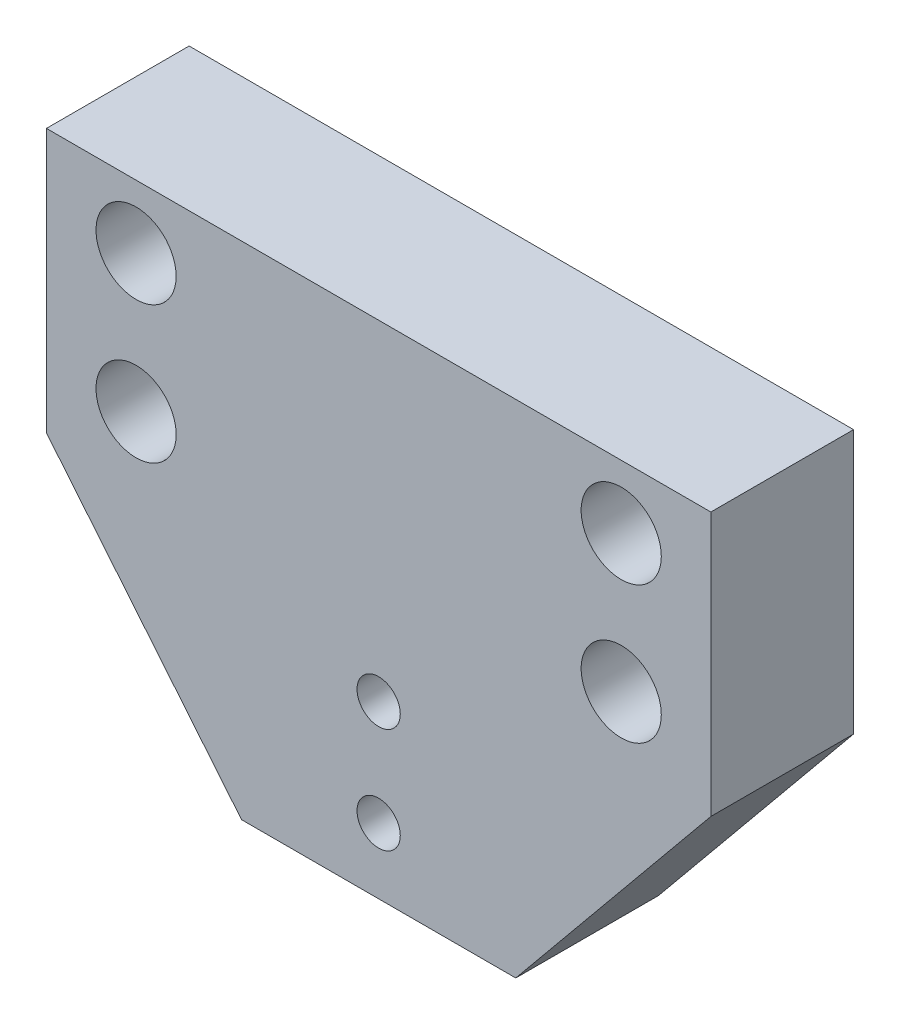
ISO-10303-21;
HEADER;
FILE_DESCRIPTION(('STEP AP214'),'2;1');
FILE_NAME('part.step','',(''),(''),'','','');
FILE_SCHEMA(('AUTOMOTIVE_DESIGN { 1 0 10303 214 1 1 1 1 }'));
ENDSEC;
DATA;
#1=APPLICATION_CONTEXT('core data for automotive mechanical design processes');
#2=APPLICATION_PROTOCOL_DEFINITION('international standard','automotive_design',2000,#1);
#3=PRODUCT_CONTEXT('',#1,'mechanical');
#4=PRODUCT('Part','Part','',(#3));
#5=PRODUCT_RELATED_PRODUCT_CATEGORY('part','',(#4));
#6=PRODUCT_DEFINITION_FORMATION('','',#4);
#7=PRODUCT_DEFINITION_CONTEXT('part definition',#1,'design');
#8=PRODUCT_DEFINITION('design','',#6,#7);
#9=PRODUCT_DEFINITION_SHAPE('','',#8);
#10=(LENGTH_UNIT() NAMED_UNIT(*) SI_UNIT(.MILLI.,.METRE.));
#11=(NAMED_UNIT(*) PLANE_ANGLE_UNIT() SI_UNIT($,.RADIAN.));
#12=(NAMED_UNIT(*) SI_UNIT($,.STERADIAN.) SOLID_ANGLE_UNIT());
#13=UNCERTAINTY_MEASURE_WITH_UNIT(LENGTH_MEASURE(1.E-05),#10,'distance_accuracy_value','');
#14=(GEOMETRIC_REPRESENTATION_CONTEXT(3) GLOBAL_UNCERTAINTY_ASSIGNED_CONTEXT((#13)) GLOBAL_UNIT_ASSIGNED_CONTEXT((#10,
#11,#12)) REPRESENTATION_CONTEXT('',''));
#15=CARTESIAN_POINT('',(0.,0.,0.));
#16=DIRECTION('',(0.,0.,1.));
#17=DIRECTION('',(1.,0.,0.));
#18=AXIS2_PLACEMENT_3D('',#15,#16,#17);
#19=CARTESIAN_POINT('',(31.5,0.,13.53));
#20=DIRECTION('',(1.,0.,0.));
#21=DIRECTION('',(0.,0.,-1.));
#22=AXIS2_PLACEMENT_3D('',#19,#20,#21);
#23=PLANE('',#22);
#24=DIRECTION('',(0.,-1.,0.));
#25=VECTOR('',#24,1.);
#26=CARTESIAN_POINT('',(31.5,0.,0.));
#27=LINE('',#26,#25);
#28=CARTESIAN_POINT('',(31.5,9.99999999999999,0.));
#29=VERTEX_POINT('',#28);
#30=CARTESIAN_POINT('',(31.5,-15.,0.));
#31=VERTEX_POINT('',#30);
#32=EDGE_CURVE('E127',#29,#31,#27,.T.);
#33=ORIENTED_EDGE('',*,*,#32,.F.);
#34=DIRECTION('',(0.,0.,-1.));
#35=VECTOR('',#34,1.);
#36=CARTESIAN_POINT('',(31.5,9.99999999999999,13.53));
#37=LINE('',#36,#35);
#38=CARTESIAN_POINT('',(31.5,9.99999999999999,13.53));
#39=VERTEX_POINT('',#38);
#40=EDGE_CURVE('E11',#39,#29,#37,.T.);
#41=ORIENTED_EDGE('',*,*,#40,.F.);
#42=DIRECTION('',(0.,-1.,0.));
#43=VECTOR('',#42,1.);
#44=CARTESIAN_POINT('',(31.5,0.,13.53));
#45=LINE('',#44,#43);
#46=CARTESIAN_POINT('',(31.5,-15.,13.53));
#47=VERTEX_POINT('',#46);
#48=EDGE_CURVE('E62',#39,#47,#45,.T.);
#49=ORIENTED_EDGE('',*,*,#48,.T.);
#50=DIRECTION('',(0.,0.,-1.));
#51=VECTOR('',#50,1.);
#52=CARTESIAN_POINT('',(31.5,-15.,13.53));
#53=LINE('',#52,#51);
#54=EDGE_CURVE('E81',#47,#31,#53,.T.);
#55=ORIENTED_EDGE('',*,*,#54,.T.);
#56=EDGE_LOOP('',(#33,#41,#49,#55));
#57=FACE_BOUND('',#56,.T.);
#58=ADVANCED_FACE('F45',(#57),#23,.T.);
#59=CARTESIAN_POINT('',(0.,9.99999999999999,13.53));
#60=DIRECTION('',(0.,-1.,0.));
#61=DIRECTION('',(1.,0.,0.));
#62=AXIS2_PLACEMENT_3D('',#59,#60,#61);
#63=PLANE('',#62);
#64=DIRECTION('',(-1.,0.,0.));
#65=VECTOR('',#64,1.);
#66=CARTESIAN_POINT('',(0.,9.99999999999999,0.));
#67=LINE('',#66,#65);
#68=CARTESIAN_POINT('',(-31.5,10.,0.));
#69=VERTEX_POINT('',#68);
#70=EDGE_CURVE('E76',#29,#69,#67,.T.);
#71=ORIENTED_EDGE('',*,*,#70,.T.);
#72=DIRECTION('',(0.,0.,-1.));
#73=VECTOR('',#72,1.);
#74=CARTESIAN_POINT('',(-31.5,10.,13.53));
#75=LINE('',#74,#73);
#76=CARTESIAN_POINT('',(-31.5,10.,13.53));
#77=VERTEX_POINT('',#76);
#78=EDGE_CURVE('E54',#77,#69,#75,.T.);
#79=ORIENTED_EDGE('',*,*,#78,.F.);
#80=DIRECTION('',(-1.,0.,0.));
#81=VECTOR('',#80,1.);
#82=CARTESIAN_POINT('',(0.,9.99999999999999,13.53));
#83=LINE('',#82,#81);
#84=EDGE_CURVE('E138',#39,#77,#83,.T.);
#85=ORIENTED_EDGE('',*,*,#84,.F.);
#86=ORIENTED_EDGE('',*,*,#40,.T.);
#87=EDGE_LOOP('',(#71,#79,#85,#86));
#88=FACE_BOUND('',#87,.T.);
#89=ADVANCED_FACE('F240',(#88),#63,.F.);
#90=CARTESIAN_POINT('',(-31.5,0.,13.53));
#91=DIRECTION('',(1.,0.,0.));
#92=DIRECTION('',(0.,0.,-1.));
#93=AXIS2_PLACEMENT_3D('',#90,#91,#92);
#94=PLANE('',#93);
#95=DIRECTION('',(0.,-1.,0.));
#96=VECTOR('',#95,1.);
#97=CARTESIAN_POINT('',(-31.5,0.,0.));
#98=LINE('',#97,#96);
#99=CARTESIAN_POINT('',(-31.5,-15.,0.));
#100=VERTEX_POINT('',#99);
#101=EDGE_CURVE('E163',#69,#100,#98,.T.);
#102=ORIENTED_EDGE('',*,*,#101,.T.);
#103=DIRECTION('',(0.,0.,-1.));
#104=VECTOR('',#103,1.);
#105=CARTESIAN_POINT('',(-31.5,-15.,13.53));
#106=LINE('',#105,#104);
#107=CARTESIAN_POINT('',(-31.5,-15.,13.53));
#108=VERTEX_POINT('',#107);
#109=EDGE_CURVE('E183',#108,#100,#106,.T.);
#110=ORIENTED_EDGE('',*,*,#109,.F.);
#111=DIRECTION('',(0.,-1.,0.));
#112=VECTOR('',#111,1.);
#113=CARTESIAN_POINT('',(-31.5,0.,13.53));
#114=LINE('',#113,#112);
#115=EDGE_CURVE('E142',#77,#108,#114,.T.);
#116=ORIENTED_EDGE('',*,*,#115,.F.);
#117=ORIENTED_EDGE('',*,*,#78,.T.);
#118=EDGE_LOOP('',(#102,#110,#116,#117));
#119=FACE_BOUND('',#118,.T.);
#120=ADVANCED_FACE('F190',(#119),#94,.F.);
#121=CARTESIAN_POINT('',(23.,-9.00000000000001,13.53));
#122=DIRECTION('',(0.,0.,-1.));
#123=DIRECTION('',(-1.,0.,0.));
#124=AXIS2_PLACEMENT_3D('',#121,#122,#123);
#125=CYLINDRICAL_SURFACE('',#124,3.8);
#126=CARTESIAN_POINT('',(23.,-9.00000000000001,13.53));
#127=DIRECTION('',(0.,0.,1.));
#128=DIRECTION('',(1.,0.,0.));
#129=AXIS2_PLACEMENT_3D('',#126,#127,#128);
#130=CIRCLE('',#129,3.8);
#131=CARTESIAN_POINT('',(26.8,-9.00000000000001,13.53));
#132=VERTEX_POINT('',#131);
#133=EDGE_CURVE('E153',#132,#132,#130,.F.);
#134=ORIENTED_EDGE('',*,*,#133,.F.);
#135=EDGE_LOOP('',(#134));
#136=FACE_BOUND('',#135,.T.);
#137=CARTESIAN_POINT('',(23.,-9.00000000000001,0.));
#138=DIRECTION('',(0.,0.,1.));
#139=DIRECTION('',(1.,0.,0.));
#140=AXIS2_PLACEMENT_3D('',#137,#138,#139);
#141=CIRCLE('',#140,3.8);
#142=CARTESIAN_POINT('',(26.8,-9.00000000000001,0.));
#143=VERTEX_POINT('',#142);
#144=EDGE_CURVE('E174',#143,#143,#141,.F.);
#145=ORIENTED_EDGE('',*,*,#144,.T.);
#146=EDGE_LOOP('',(#145));
#147=FACE_BOUND('',#146,.T.);
#148=ADVANCED_FACE('F247',(#136,#147),#125,.F.);
#149=CARTESIAN_POINT('',(-23.,-9.00000000000001,13.53));
#150=DIRECTION('',(0.,0.,-1.));
#151=DIRECTION('',(-1.,0.,0.));
#152=AXIS2_PLACEMENT_3D('',#149,#150,#151);
#153=CYLINDRICAL_SURFACE('',#152,3.8);
#154=CARTESIAN_POINT('',(-23.,-9.00000000000001,13.53));
#155=DIRECTION('',(0.,0.,1.));
#156=DIRECTION('',(1.,0.,0.));
#157=AXIS2_PLACEMENT_3D('',#154,#155,#156);
#158=CIRCLE('',#157,3.8);
#159=CARTESIAN_POINT('',(-19.2,-9.00000000000001,13.53));
#160=VERTEX_POINT('',#159);
#161=EDGE_CURVE('E149',#160,#160,#158,.T.);
#162=ORIENTED_EDGE('',*,*,#161,.T.);
#163=EDGE_LOOP('',(#162));
#164=FACE_BOUND('',#163,.T.);
#165=CARTESIAN_POINT('',(-23.,-9.00000000000001,0.));
#166=DIRECTION('',(0.,0.,1.));
#167=DIRECTION('',(1.,0.,0.));
#168=AXIS2_PLACEMENT_3D('',#165,#166,#167);
#169=CIRCLE('',#168,3.8);
#170=CARTESIAN_POINT('',(-19.2,-9.00000000000001,0.));
#171=VERTEX_POINT('',#170);
#172=EDGE_CURVE('E170',#171,#171,#169,.T.);
#173=ORIENTED_EDGE('',*,*,#172,.F.);
#174=EDGE_LOOP('',(#173));
#175=FACE_BOUND('',#174,.T.);
#176=ADVANCED_FACE('F252',(#164,#175),#153,.F.);
#177=CARTESIAN_POINT('',(-23.,4.,13.53));
#178=DIRECTION('',(0.,0.,-1.));
#179=DIRECTION('',(-1.,0.,0.));
#180=AXIS2_PLACEMENT_3D('',#177,#178,#179);
#181=CYLINDRICAL_SURFACE('',#180,3.8);
#182=CARTESIAN_POINT('',(-23.,4.,13.53));
#183=DIRECTION('',(0.,0.,1.));
#184=DIRECTION('',(1.,0.,0.));
#185=AXIS2_PLACEMENT_3D('',#182,#183,#184);
#186=CIRCLE('',#185,3.8);
#187=CARTESIAN_POINT('',(-19.2,4.,13.53));
#188=VERTEX_POINT('',#187);
#189=EDGE_CURVE('E145',#188,#188,#186,.T.);
#190=ORIENTED_EDGE('',*,*,#189,.T.);
#191=EDGE_LOOP('',(#190));
#192=FACE_BOUND('',#191,.T.);
#193=CARTESIAN_POINT('',(-23.,4.,0.));
#194=DIRECTION('',(0.,0.,1.));
#195=DIRECTION('',(1.,0.,0.));
#196=AXIS2_PLACEMENT_3D('',#193,#194,#195);
#197=CIRCLE('',#196,3.8);
#198=CARTESIAN_POINT('',(-19.2,4.,0.));
#199=VERTEX_POINT('',#198);
#200=EDGE_CURVE('E166',#199,#199,#197,.T.);
#201=ORIENTED_EDGE('',*,*,#200,.F.);
#202=EDGE_LOOP('',(#201));
#203=FACE_BOUND('',#202,.T.);
#204=ADVANCED_FACE('F235',(#192,#203),#181,.F.);
#205=CARTESIAN_POINT('',(23.,4.,13.53));
#206=DIRECTION('',(0.,0.,-1.));
#207=DIRECTION('',(-1.,0.,0.));
#208=AXIS2_PLACEMENT_3D('',#205,#206,#207);
#209=CYLINDRICAL_SURFACE('',#208,3.8);
#210=CARTESIAN_POINT('',(23.,4.,13.53));
#211=DIRECTION('',(0.,0.,1.));
#212=DIRECTION('',(1.,0.,0.));
#213=AXIS2_PLACEMENT_3D('',#210,#211,#212);
#214=CIRCLE('',#213,3.8);
#215=CARTESIAN_POINT('',(26.8,4.,13.53));
#216=VERTEX_POINT('',#215);
#217=EDGE_CURVE('E157',#216,#216,#214,.F.);
#218=ORIENTED_EDGE('',*,*,#217,.F.);
#219=EDGE_LOOP('',(#218));
#220=FACE_BOUND('',#219,.T.);
#221=CARTESIAN_POINT('',(23.,4.,0.));
#222=DIRECTION('',(0.,0.,1.));
#223=DIRECTION('',(1.,0.,0.));
#224=AXIS2_PLACEMENT_3D('',#221,#222,#223);
#225=CIRCLE('',#224,3.8);
#226=CARTESIAN_POINT('',(26.8,4.,0.));
#227=VERTEX_POINT('',#226);
#228=EDGE_CURVE('E139',#227,#227,#225,.F.);
#229=ORIENTED_EDGE('',*,*,#228,.T.);
#230=EDGE_LOOP('',(#229));
#231=FACE_BOUND('',#230,.T.);
#232=ADVANCED_FACE('F228',(#220,#231),#209,.F.);
#233=CARTESIAN_POINT('',(0.,0.,13.53));
#234=DIRECTION('',(0.,0.,1.));
#235=DIRECTION('',(1.,0.,0.));
#236=AXIS2_PLACEMENT_3D('',#233,#234,#235);
#237=PLANE('',#236);
#238=ORIENTED_EDGE('',*,*,#48,.F.);
#239=ORIENTED_EDGE('',*,*,#84,.T.);
#240=ORIENTED_EDGE('',*,*,#115,.T.);
#241=DIRECTION('',(-0.63484159071382,0.772642320029098,0.));
#242=VECTOR('',#241,1.);
#243=CARTESIAN_POINT('',(-26.1623310655497,-21.4962802837536,13.53));
#244=LINE('',#243,#242);
#245=CARTESIAN_POINT('',(-13.,-37.5156686795933,13.53));
#246=VERTEX_POINT('',#245);
#247=EDGE_CURVE('E111',#246,#108,#244,.T.);
#248=ORIENTED_EDGE('',*,*,#247,.F.);
#249=DIRECTION('',(1.,0.,0.));
#250=VECTOR('',#249,1.);
#251=CARTESIAN_POINT('',(0.,-37.5156686795933,13.53));
#252=LINE('',#251,#250);
#253=CARTESIAN_POINT('',(13.,-37.5156686795933,13.53));
#254=VERTEX_POINT('',#253);
#255=EDGE_CURVE('E112',#246,#254,#252,.T.);
#256=ORIENTED_EDGE('',*,*,#255,.T.);
#257=DIRECTION('',(0.63484159071382,0.772642320029098,0.));
#258=VECTOR('',#257,1.);
#259=CARTESIAN_POINT('',(26.1623310655497,-21.4962802837536,13.53));
#260=LINE('',#259,#258);
#261=EDGE_CURVE('E102',#254,#47,#260,.T.);
#262=ORIENTED_EDGE('',*,*,#261,.T.);
#263=EDGE_LOOP('',(#238,#239,#240,#248,#256,#262));
#264=FACE_BOUND('',#263,.T.);
#265=ORIENTED_EDGE('',*,*,#189,.F.);
#266=EDGE_LOOP('',(#265));
#267=FACE_BOUND('',#266,.T.);
#268=ORIENTED_EDGE('',*,*,#161,.F.);
#269=EDGE_LOOP('',(#268));
#270=FACE_BOUND('',#269,.T.);
#271=ORIENTED_EDGE('',*,*,#133,.T.);
#272=EDGE_LOOP('',(#271));
#273=FACE_BOUND('',#272,.T.);
#274=ORIENTED_EDGE('',*,*,#217,.T.);
#275=EDGE_LOOP('',(#274));
#276=FACE_BOUND('',#275,.T.);
#277=CARTESIAN_POINT('',(0.,-31.2999555570793,13.53));
#278=DIRECTION('',(0.,0.,1.));
#279=DIRECTION('',(1.,0.,0.));
#280=AXIS2_PLACEMENT_3D('',#277,#278,#279);
#281=CIRCLE('',#280,2.05);
#282=CARTESIAN_POINT('',(2.05,-31.2999555570793,13.53));
#283=VERTEX_POINT('',#282);
#284=EDGE_CURVE('E200',#283,#283,#281,.T.);
#285=ORIENTED_EDGE('',*,*,#284,.F.);
#286=EDGE_LOOP('',(#285));
#287=FACE_BOUND('',#286,.T.);
#288=CARTESIAN_POINT('',(0.,-21.3220695835742,13.53));
#289=DIRECTION('',(0.,0.,1.));
#290=DIRECTION('',(1.,0.,0.));
#291=AXIS2_PLACEMENT_3D('',#288,#289,#290);
#292=CIRCLE('',#291,2.05);
#293=CARTESIAN_POINT('',(2.05,-21.3220695835742,13.53));
#294=VERTEX_POINT('',#293);
#295=EDGE_CURVE('E121',#294,#294,#292,.T.);
#296=ORIENTED_EDGE('',*,*,#295,.F.);
#297=EDGE_LOOP('',(#296));
#298=FACE_BOUND('',#297,.T.);
#299=ADVANCED_FACE('F116',(#264,#267,#270,#273,#276,#287,#298),#237,.T.);
#300=CARTESIAN_POINT('',(0.,0.,0.));
#301=DIRECTION('',(0.,0.,1.));
#302=DIRECTION('',(1.,0.,0.));
#303=AXIS2_PLACEMENT_3D('',#300,#301,#302);
#304=PLANE('',#303);
#305=ORIENTED_EDGE('',*,*,#32,.T.);
#306=DIRECTION('',(0.63484159071382,0.772642320029098,0.));
#307=VECTOR('',#306,1.);
#308=CARTESIAN_POINT('',(26.1623310655497,-21.4962802837536,0.));
#309=LINE('',#308,#307);
#310=CARTESIAN_POINT('',(13.,-37.5156686795933,0.));
#311=VERTEX_POINT('',#310);
#312=EDGE_CURVE('E201',#311,#31,#309,.T.);
#313=ORIENTED_EDGE('',*,*,#312,.F.);
#314=DIRECTION('',(1.,0.,0.));
#315=VECTOR('',#314,1.);
#316=CARTESIAN_POINT('',(0.,-37.5156686795933,0.));
#317=LINE('',#316,#315);
#318=CARTESIAN_POINT('',(-13.,-37.5156686795933,0.));
#319=VERTEX_POINT('',#318);
#320=EDGE_CURVE('E125',#319,#311,#317,.T.);
#321=ORIENTED_EDGE('',*,*,#320,.F.);
#322=DIRECTION('',(-0.63484159071382,0.772642320029098,0.));
#323=VECTOR('',#322,1.);
#324=CARTESIAN_POINT('',(-26.1623310655497,-21.4962802837536,0.));
#325=LINE('',#324,#323);
#326=EDGE_CURVE('E197',#319,#100,#325,.T.);
#327=ORIENTED_EDGE('',*,*,#326,.T.);
#328=ORIENTED_EDGE('',*,*,#101,.F.);
#329=ORIENTED_EDGE('',*,*,#70,.F.);
#330=EDGE_LOOP('',(#305,#313,#321,#327,#328,#329));
#331=FACE_BOUND('',#330,.T.);
#332=ORIENTED_EDGE('',*,*,#200,.T.);
#333=EDGE_LOOP('',(#332));
#334=FACE_BOUND('',#333,.T.);
#335=ORIENTED_EDGE('',*,*,#172,.T.);
#336=EDGE_LOOP('',(#335));
#337=FACE_BOUND('',#336,.T.);
#338=ORIENTED_EDGE('',*,*,#144,.F.);
#339=EDGE_LOOP('',(#338));
#340=FACE_BOUND('',#339,.T.);
#341=ORIENTED_EDGE('',*,*,#228,.F.);
#342=EDGE_LOOP('',(#341));
#343=FACE_BOUND('',#342,.T.);
#344=CARTESIAN_POINT('',(0.,-31.2999555570793,0.));
#345=DIRECTION('',(0.,0.,1.));
#346=DIRECTION('',(1.,0.,0.));
#347=AXIS2_PLACEMENT_3D('',#344,#345,#346);
#348=CIRCLE('',#347,2.05);
#349=CARTESIAN_POINT('',(2.05,-31.2999555570793,0.));
#350=VERTEX_POINT('',#349);
#351=EDGE_CURVE('E214',#350,#350,#348,.T.);
#352=ORIENTED_EDGE('',*,*,#351,.T.);
#353=EDGE_LOOP('',(#352));
#354=FACE_BOUND('',#353,.T.);
#355=CARTESIAN_POINT('',(0.,-21.3220695835742,0.));
#356=DIRECTION('',(0.,0.,1.));
#357=DIRECTION('',(1.,0.,0.));
#358=AXIS2_PLACEMENT_3D('',#355,#356,#357);
#359=CIRCLE('',#358,2.05);
#360=CARTESIAN_POINT('',(2.05,-21.3220695835742,0.));
#361=VERTEX_POINT('',#360);
#362=EDGE_CURVE('E210',#361,#361,#359,.T.);
#363=ORIENTED_EDGE('',*,*,#362,.T.);
#364=EDGE_LOOP('',(#363));
#365=FACE_BOUND('',#364,.T.);
#366=ADVANCED_FACE('F194',(#331,#334,#337,#340,#343,#354,#365),#304,.F.);
#367=CARTESIAN_POINT('',(0.,-37.5156686795933,13.53));
#368=DIRECTION('',(0.,1.,0.));
#369=DIRECTION('',(0.,0.,1.));
#370=AXIS2_PLACEMENT_3D('',#367,#368,#369);
#371=PLANE('',#370);
#372=ORIENTED_EDGE('',*,*,#320,.T.);
#373=DIRECTION('',(0.,0.,-1.));
#374=VECTOR('',#373,1.);
#375=CARTESIAN_POINT('',(13.,-37.5156686795933,13.53));
#376=LINE('',#375,#374);
#377=EDGE_CURVE('E107',#254,#311,#376,.T.);
#378=ORIENTED_EDGE('',*,*,#377,.F.);
#379=ORIENTED_EDGE('',*,*,#255,.F.);
#380=DIRECTION('',(0.,0.,-1.));
#381=VECTOR('',#380,1.);
#382=CARTESIAN_POINT('',(-13.,-37.5156686795933,13.53));
#383=LINE('',#382,#381);
#384=EDGE_CURVE('E128',#246,#319,#383,.T.);
#385=ORIENTED_EDGE('',*,*,#384,.T.);
#386=EDGE_LOOP('',(#372,#378,#379,#385));
#387=FACE_BOUND('',#386,.T.);
#388=ADVANCED_FACE('F123',(#387),#371,.F.);
#389=CARTESIAN_POINT('',(26.1623310655497,-21.4962802837536,13.53));
#390=DIRECTION('',(-0.772642320029098,0.63484159071382,0.));
#391=DIRECTION('',(-0.63484159071382,-0.772642320029098,0.));
#392=AXIS2_PLACEMENT_3D('',#389,#390,#391);
#393=PLANE('',#392);
#394=ORIENTED_EDGE('',*,*,#312,.T.);
#395=ORIENTED_EDGE('',*,*,#54,.F.);
#396=ORIENTED_EDGE('',*,*,#261,.F.);
#397=ORIENTED_EDGE('',*,*,#377,.T.);
#398=EDGE_LOOP('',(#394,#395,#396,#397));
#399=FACE_BOUND('',#398,.T.);
#400=ADVANCED_FACE('F105',(#399),#393,.F.);
#401=CARTESIAN_POINT('',(0.,-21.3220695835742,13.53));
#402=DIRECTION('',(0.,0.,-1.));
#403=DIRECTION('',(-1.,0.,0.));
#404=AXIS2_PLACEMENT_3D('',#401,#402,#403);
#405=CYLINDRICAL_SURFACE('',#404,2.05);
#406=ORIENTED_EDGE('',*,*,#295,.T.);
#407=EDGE_LOOP('',(#406));
#408=FACE_BOUND('',#407,.T.);
#409=ORIENTED_EDGE('',*,*,#362,.F.);
#410=EDGE_LOOP('',(#409));
#411=FACE_BOUND('',#410,.T.);
#412=ADVANCED_FACE('F224',(#408,#411),#405,.F.);
#413=CARTESIAN_POINT('',(0.,-31.2999555570793,13.53));
#414=DIRECTION('',(0.,0.,-1.));
#415=DIRECTION('',(-1.,0.,0.));
#416=AXIS2_PLACEMENT_3D('',#413,#414,#415);
#417=CYLINDRICAL_SURFACE('',#416,2.05);
#418=ORIENTED_EDGE('',*,*,#284,.T.);
#419=EDGE_LOOP('',(#418));
#420=FACE_BOUND('',#419,.T.);
#421=ORIENTED_EDGE('',*,*,#351,.F.);
#422=EDGE_LOOP('',(#421));
#423=FACE_BOUND('',#422,.T.);
#424=ADVANCED_FACE('F272',(#420,#423),#417,.F.);
#425=CARTESIAN_POINT('',(-26.1623310655497,-21.4962802837536,13.53));
#426=DIRECTION('',(-0.772642320029098,-0.63484159071382,0.));
#427=DIRECTION('',(0.63484159071382,-0.772642320029098,0.));
#428=AXIS2_PLACEMENT_3D('',#425,#426,#427);
#429=PLANE('',#428);
#430=ORIENTED_EDGE('',*,*,#326,.F.);
#431=ORIENTED_EDGE('',*,*,#384,.F.);
#432=ORIENTED_EDGE('',*,*,#247,.T.);
#433=ORIENTED_EDGE('',*,*,#109,.T.);
#434=EDGE_LOOP('',(#430,#431,#432,#433));
#435=FACE_BOUND('',#434,.T.);
#436=ADVANCED_FACE('F278',(#435),#429,.T.);
#437=CLOSED_SHELL('',(#58,#89,#120,#148,#176,#204,#232,#299,#366,#388,#400,#412,#424,#436));
#438=MANIFOLD_SOLID_BREP('B2',#437);
#439=ADVANCED_BREP_SHAPE_REPRESENTATION('',(#18,#438),#14);
#440=SHAPE_DEFINITION_REPRESENTATION(#9,#439);
ENDSEC;
END-ISO-10303-21;
